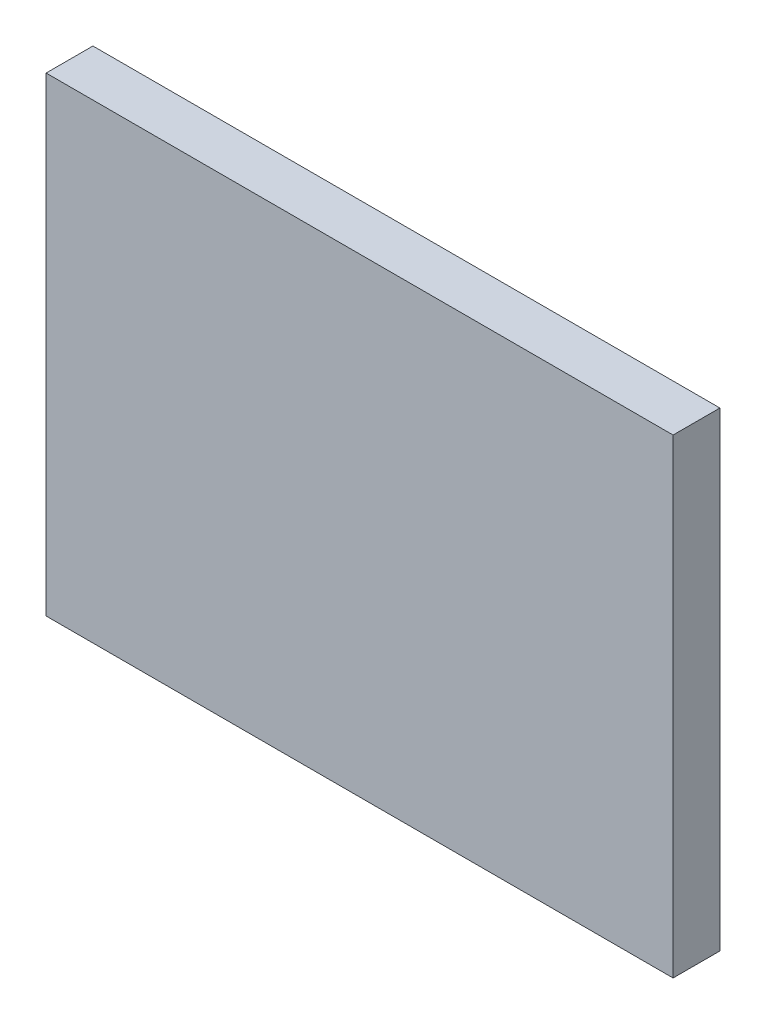
ISO-10303-21;
HEADER;
FILE_DESCRIPTION(('STEP AP214'),'2;1');
FILE_NAME('part.step','',(''),(''),'','','');
FILE_SCHEMA(('AUTOMOTIVE_DESIGN { 1 0 10303 214 1 1 1 1 }'));
ENDSEC;
DATA;
#1=APPLICATION_CONTEXT('core data for automotive mechanical design processes');
#2=APPLICATION_PROTOCOL_DEFINITION('international standard','automotive_design',2000,#1);
#3=PRODUCT_CONTEXT('',#1,'mechanical');
#4=PRODUCT('Part','Part','',(#3));
#5=PRODUCT_RELATED_PRODUCT_CATEGORY('part','',(#4));
#6=PRODUCT_DEFINITION_FORMATION('','',#4);
#7=PRODUCT_DEFINITION_CONTEXT('part definition',#1,'design');
#8=PRODUCT_DEFINITION('design','',#6,#7);
#9=PRODUCT_DEFINITION_SHAPE('','',#8);
#10=(LENGTH_UNIT() NAMED_UNIT(*) SI_UNIT(.MILLI.,.METRE.));
#11=(NAMED_UNIT(*) PLANE_ANGLE_UNIT() SI_UNIT($,.RADIAN.));
#12=(NAMED_UNIT(*) SI_UNIT($,.STERADIAN.) SOLID_ANGLE_UNIT());
#13=UNCERTAINTY_MEASURE_WITH_UNIT(LENGTH_MEASURE(1.E-05),#10,'distance_accuracy_value','');
#14=(GEOMETRIC_REPRESENTATION_CONTEXT(3) GLOBAL_UNCERTAINTY_ASSIGNED_CONTEXT((#13)) GLOBAL_UNIT_ASSIGNED_CONTEXT((#10,
#11,#12)) REPRESENTATION_CONTEXT('',''));
#15=CARTESIAN_POINT('',(0.,0.,0.));
#16=DIRECTION('',(0.,0.,1.));
#17=DIRECTION('',(1.,0.,0.));
#18=AXIS2_PLACEMENT_3D('',#15,#16,#17);
#19=CARTESIAN_POINT('',(28.80000082,21.59999998,4.29999902));
#20=DIRECTION('',(0.,0.,-1.));
#21=DIRECTION('',(-1.,0.,0.));
#22=AXIS2_PLACEMENT_3D('',#19,#20,#21);
#23=PLANE('',#22);
#24=DIRECTION('',(0.,1.,0.));
#25=VECTOR('',#24,1.);
#26=CARTESIAN_POINT('',(-28.80000082,21.59999998,4.29999902));
#27=LINE('',#26,#25);
#28=CARTESIAN_POINT('',(-28.80000082,21.59999998,4.29999902));
#29=VERTEX_POINT('',#28);
#30=CARTESIAN_POINT('',(-28.80000082,-21.59999998,4.29999902));
#31=VERTEX_POINT('',#30);
#32=EDGE_CURVE('E55',#29,#31,#27,.F.);
#33=ORIENTED_EDGE('',*,*,#32,.T.);
#34=DIRECTION('',(1.,0.,0.));
#35=VECTOR('',#34,1.);
#36=CARTESIAN_POINT('',(-28.80000082,-21.59999998,4.29999902));
#37=LINE('',#36,#35);
#38=CARTESIAN_POINT('',(28.80000082,-21.59999998,4.29999902));
#39=VERTEX_POINT('',#38);
#40=EDGE_CURVE('E57',#31,#39,#37,.T.);
#41=ORIENTED_EDGE('',*,*,#40,.T.);
#42=DIRECTION('',(0.,1.,0.));
#43=VECTOR('',#42,1.);
#44=CARTESIAN_POINT('',(28.80000082,-21.59999998,4.29999902));
#45=LINE('',#44,#43);
#46=CARTESIAN_POINT('',(28.80000082,21.59999998,4.29999902));
#47=VERTEX_POINT('',#46);
#48=EDGE_CURVE('E20',#39,#47,#45,.T.);
#49=ORIENTED_EDGE('',*,*,#48,.T.);
#50=DIRECTION('',(1.,0.,0.));
#51=VECTOR('',#50,1.);
#52=CARTESIAN_POINT('',(28.80000082,21.59999998,4.29999902));
#53=LINE('',#52,#51);
#54=EDGE_CURVE('E80',#47,#29,#53,.F.);
#55=ORIENTED_EDGE('',*,*,#54,.T.);
#56=EDGE_LOOP('',(#33,#41,#49,#55));
#57=FACE_BOUND('',#56,.T.);
#58=ADVANCED_FACE('F17',(#57),#23,.F.);
#59=CARTESIAN_POINT('',(28.80000082,-21.59999998,0.));
#60=DIRECTION('',(-1.,0.,0.));
#61=DIRECTION('',(0.,0.,1.));
#62=AXIS2_PLACEMENT_3D('',#59,#60,#61);
#63=PLANE('',#62);
#64=DIRECTION('',(0.,0.,-1.));
#65=VECTOR('',#64,1.);
#66=CARTESIAN_POINT('',(28.80000082,21.59999998,0.));
#67=LINE('',#66,#65);
#68=CARTESIAN_POINT('',(28.80000082,21.59999998,0.));
#69=VERTEX_POINT('',#68);
#70=EDGE_CURVE('E68',#69,#47,#67,.F.);
#71=ORIENTED_EDGE('',*,*,#70,.T.);
#72=ORIENTED_EDGE('',*,*,#48,.F.);
#73=DIRECTION('',(0.,0.,1.));
#74=VECTOR('',#73,1.);
#75=CARTESIAN_POINT('',(28.80000082,-21.59999998,0.));
#76=LINE('',#75,#74);
#77=CARTESIAN_POINT('',(28.80000082,-21.59999998,0.));
#78=VERTEX_POINT('',#77);
#79=EDGE_CURVE('E63',#39,#78,#76,.F.);
#80=ORIENTED_EDGE('',*,*,#79,.T.);
#81=DIRECTION('',(0.,1.,0.));
#82=VECTOR('',#81,1.);
#83=CARTESIAN_POINT('',(28.80000082,21.59999998,0.));
#84=LINE('',#83,#82);
#85=EDGE_CURVE('E83',#69,#78,#84,.F.);
#86=ORIENTED_EDGE('',*,*,#85,.F.);
#87=EDGE_LOOP('',(#71,#72,#80,#86));
#88=FACE_BOUND('',#87,.T.);
#89=ADVANCED_FACE('F65',(#88),#63,.F.);
#90=CARTESIAN_POINT('',(-28.80000082,-21.59999998,0.));
#91=DIRECTION('',(0.,1.,0.));
#92=DIRECTION('',(0.,0.,1.));
#93=AXIS2_PLACEMENT_3D('',#90,#91,#92);
#94=PLANE('',#93);
#95=ORIENTED_EDGE('',*,*,#79,.F.);
#96=ORIENTED_EDGE('',*,*,#40,.F.);
#97=DIRECTION('',(0.,0.,-1.));
#98=VECTOR('',#97,1.);
#99=CARTESIAN_POINT('',(-28.80000082,-21.59999998,0.));
#100=LINE('',#99,#98);
#101=CARTESIAN_POINT('',(-28.80000082,-21.59999998,0.));
#102=VERTEX_POINT('',#101);
#103=EDGE_CURVE('E75',#31,#102,#100,.T.);
#104=ORIENTED_EDGE('',*,*,#103,.T.);
#105=DIRECTION('',(-1.,0.,0.));
#106=VECTOR('',#105,1.);
#107=CARTESIAN_POINT('',(28.80000082,-21.59999998,0.));
#108=LINE('',#107,#106);
#109=EDGE_CURVE('E72',#78,#102,#108,.T.);
#110=ORIENTED_EDGE('',*,*,#109,.F.);
#111=EDGE_LOOP('',(#95,#96,#104,#110));
#112=FACE_BOUND('',#111,.T.);
#113=ADVANCED_FACE('F70',(#112),#94,.F.);
#114=CARTESIAN_POINT('',(-28.80000082,21.59999998,0.));
#115=DIRECTION('',(1.,0.,0.));
#116=DIRECTION('',(0.,0.,-1.));
#117=AXIS2_PLACEMENT_3D('',#114,#115,#116);
#118=PLANE('',#117);
#119=ORIENTED_EDGE('',*,*,#103,.F.);
#120=ORIENTED_EDGE('',*,*,#32,.F.);
#121=DIRECTION('',(0.,0.,-1.));
#122=VECTOR('',#121,1.);
#123=CARTESIAN_POINT('',(-28.80000082,21.59999998,0.));
#124=LINE('',#123,#122);
#125=CARTESIAN_POINT('',(-28.80000082,21.59999998,0.));
#126=VERTEX_POINT('',#125);
#127=EDGE_CURVE('E35',#29,#126,#124,.T.);
#128=ORIENTED_EDGE('',*,*,#127,.T.);
#129=DIRECTION('',(0.,1.,0.));
#130=VECTOR('',#129,1.);
#131=CARTESIAN_POINT('',(-28.80000082,21.59999998,0.));
#132=LINE('',#131,#130);
#133=EDGE_CURVE('E26',#102,#126,#132,.T.);
#134=ORIENTED_EDGE('',*,*,#133,.F.);
#135=EDGE_LOOP('',(#119,#120,#128,#134));
#136=FACE_BOUND('',#135,.T.);
#137=ADVANCED_FACE('F89',(#136),#118,.F.);
#138=CARTESIAN_POINT('',(28.80000082,21.59999998,0.));
#139=DIRECTION('',(0.,-1.,0.));
#140=DIRECTION('',(0.,0.,-1.));
#141=AXIS2_PLACEMENT_3D('',#138,#139,#140);
#142=PLANE('',#141);
#143=ORIENTED_EDGE('',*,*,#127,.F.);
#144=ORIENTED_EDGE('',*,*,#54,.F.);
#145=ORIENTED_EDGE('',*,*,#70,.F.);
#146=DIRECTION('',(-1.,0.,0.));
#147=VECTOR('',#146,1.);
#148=CARTESIAN_POINT('',(28.80000082,21.59999998,0.));
#149=LINE('',#148,#147);
#150=EDGE_CURVE('E11',#126,#69,#149,.F.);
#151=ORIENTED_EDGE('',*,*,#150,.F.);
#152=EDGE_LOOP('',(#143,#144,#145,#151));
#153=FACE_BOUND('',#152,.T.);
#154=ADVANCED_FACE('F91',(#153),#142,.F.);
#155=CARTESIAN_POINT('',(28.80000082,21.59999998,0.));
#156=DIRECTION('',(0.,0.,-1.));
#157=DIRECTION('',(-1.,0.,0.));
#158=AXIS2_PLACEMENT_3D('',#155,#156,#157);
#159=PLANE('',#158);
#160=ORIENTED_EDGE('',*,*,#133,.T.);
#161=ORIENTED_EDGE('',*,*,#150,.T.);
#162=ORIENTED_EDGE('',*,*,#85,.T.);
#163=ORIENTED_EDGE('',*,*,#109,.T.);
#164=EDGE_LOOP('',(#160,#161,#162,#163));
#165=FACE_BOUND('',#164,.T.);
#166=ADVANCED_FACE('F88',(#165),#159,.T.);
#167=CLOSED_SHELL('',(#58,#89,#113,#137,#154,#166));
#168=MANIFOLD_SOLID_BREP('B1',#167);
#169=ADVANCED_BREP_SHAPE_REPRESENTATION('',(#18,#168),#14);
#170=SHAPE_DEFINITION_REPRESENTATION(#9,#169);
ENDSEC;
END-ISO-10303-21;
